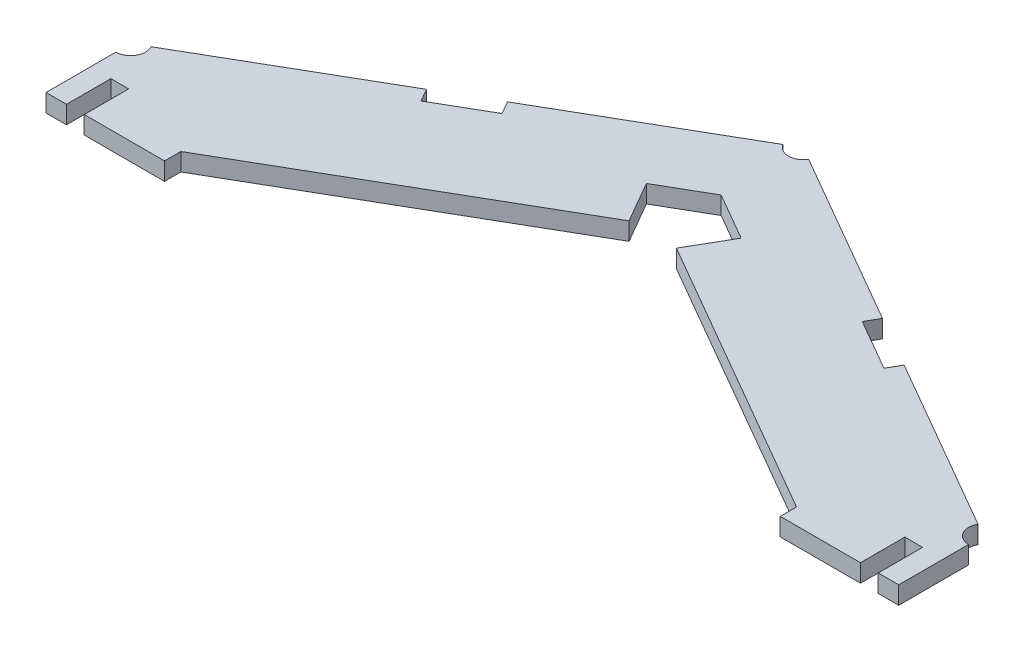
ISO-10303-21;
HEADER;
FILE_DESCRIPTION(('STEP AP214'),'2;1');
FILE_NAME('part.step','',(''),(''),'','','');
FILE_SCHEMA(('AUTOMOTIVE_DESIGN { 1 0 10303 214 1 1 1 1 }'));
ENDSEC;
DATA;
#1=APPLICATION_CONTEXT('core data for automotive mechanical design processes');
#2=APPLICATION_PROTOCOL_DEFINITION('international standard','automotive_design',2000,#1);
#3=PRODUCT_CONTEXT('',#1,'mechanical');
#4=PRODUCT('Part','Part','',(#3));
#5=PRODUCT_RELATED_PRODUCT_CATEGORY('part','',(#4));
#6=PRODUCT_DEFINITION_FORMATION('','',#4);
#7=PRODUCT_DEFINITION_CONTEXT('part definition',#1,'design');
#8=PRODUCT_DEFINITION('design','',#6,#7);
#9=PRODUCT_DEFINITION_SHAPE('','',#8);
#10=(LENGTH_UNIT() NAMED_UNIT(*) SI_UNIT(.MILLI.,.METRE.));
#11=(NAMED_UNIT(*) PLANE_ANGLE_UNIT() SI_UNIT($,.RADIAN.));
#12=(NAMED_UNIT(*) SI_UNIT($,.STERADIAN.) SOLID_ANGLE_UNIT());
#13=UNCERTAINTY_MEASURE_WITH_UNIT(LENGTH_MEASURE(1.E-05),#10,'distance_accuracy_value','');
#14=(GEOMETRIC_REPRESENTATION_CONTEXT(3) GLOBAL_UNCERTAINTY_ASSIGNED_CONTEXT((#13)) GLOBAL_UNIT_ASSIGNED_CONTEXT((#10,
#11,#12)) REPRESENTATION_CONTEXT('',''));
#15=CARTESIAN_POINT('',(0.,0.,0.));
#16=DIRECTION('',(0.,0.,1.));
#17=DIRECTION('',(1.,0.,0.));
#18=AXIS2_PLACEMENT_3D('',#15,#16,#17);
#19=CARTESIAN_POINT('',(-71.9715242270662,-30.,-27.25));
#20=DIRECTION('',(0.,-1.,0.));
#21=DIRECTION('',(0.,0.,-1.));
#22=AXIS2_PLACEMENT_3D('',#19,#20,#21);
#23=PLANE('',#22);
#24=DIRECTION('',(0.866025403784439,0.,0.5));
#25=VECTOR('',#24,1.);
#26=CARTESIAN_POINT('',(71.9615242270662,-30.,-41.5470053837925));
#27=LINE('',#26,#25);
#28=CARTESIAN_POINT('',(40.3108891324556,-30.,-59.8205080756885));
#29=VERTEX_POINT('',#28);
#30=CARTESIAN_POINT('',(69.7964607176053,-30.,-42.7970053837924));
#31=VERTEX_POINT('',#30);
#32=EDGE_CURVE('E656',#29,#31,#27,.T.);
#33=ORIENTED_EDGE('',*,*,#32,.F.);
#34=DIRECTION('',(0.500000000000006,0.,-0.866025403784435));
#35=VECTOR('',#34,1.);
#36=CARTESIAN_POINT('',(39.0608891324556,-30.,-57.6554445662274));
#37=LINE('',#36,#35);
#38=CARTESIAN_POINT('',(39.0608891324556,-30.,-57.6554445662274));
#39=VERTEX_POINT('',#38);
#40=EDGE_CURVE('E598',#39,#29,#37,.T.);
#41=ORIENTED_EDGE('',*,*,#40,.F.);
#42=DIRECTION('',(0.866025403784436,0.,0.500000000000005));
#43=VECTOR('',#42,1.);
#44=CARTESIAN_POINT('',(39.0608891324556,-30.,-57.6554445662274));
#45=LINE('',#44,#43);
#46=CARTESIAN_POINT('',(30.4006350946112,-30.,-62.6554445662274));
#47=VERTEX_POINT('',#46);
#48=EDGE_CURVE('E593',#47,#39,#45,.T.);
#49=ORIENTED_EDGE('',*,*,#48,.F.);
#50=DIRECTION('',(-0.500000000000005,0.,0.866025403784436));
#51=VECTOR('',#50,1.);
#52=CARTESIAN_POINT('',(30.4006350946112,-30.,-62.6554445662274));
#53=LINE('',#52,#51);
#54=CARTESIAN_POINT('',(31.6506350946112,-30.,-64.8205080756885));
#55=VERTEX_POINT('',#54);
#56=EDGE_CURVE('E662',#55,#47,#53,.T.);
#57=ORIENTED_EDGE('',*,*,#56,.F.);
#58=DIRECTION('',(0.866025403784439,0.,0.5));
#59=VECTOR('',#58,1.);
#60=CARTESIAN_POINT('',(71.9615242270662,-30.,-41.5470053837925));
#61=LINE('',#60,#59);
#62=CARTESIAN_POINT('',(2.1650635094611,-30.,-81.8440107675849));
#63=VERTEX_POINT('',#62);
#64=EDGE_CURVE('E584',#63,#55,#61,.T.);
#65=ORIENTED_EDGE('',*,*,#64,.F.);
#66=CARTESIAN_POINT('',(0.,-30.,-83.0940107675849));
#67=DIRECTION('',(0.,-1.,0.));
#68=DIRECTION('',(0.,0.,-1.));
#69=AXIS2_PLACEMENT_3D('',#66,#67,#68);
#70=CIRCLE('',#69,2.5);
#71=CARTESIAN_POINT('',(-2.16506350946109,-30.,-81.8440107675849));
#72=VERTEX_POINT('',#71);
#73=EDGE_CURVE('E578',#72,#63,#70,.F.);
#74=ORIENTED_EDGE('',*,*,#73,.F.);
#75=DIRECTION('',(0.866025403784439,0.,-0.5));
#76=VECTOR('',#75,1.);
#77=CARTESIAN_POINT('',(0.,-30.,-83.0940107675849));
#78=LINE('',#77,#76);
#79=CARTESIAN_POINT('',(-31.6506350946108,-30.,-64.8205080756888));
#80=VERTEX_POINT('',#79);
#81=EDGE_CURVE('E666',#80,#72,#78,.T.);
#82=ORIENTED_EDGE('',*,*,#81,.F.);
#83=DIRECTION('',(-0.499999999999999,0.,-0.866025403784439));
#84=VECTOR('',#83,1.);
#85=CARTESIAN_POINT('',(-30.4006350946108,-30.,-62.6554445662276));
#86=LINE('',#85,#84);
#87=CARTESIAN_POINT('',(-30.4006350946108,-30.,-62.6554445662276));
#88=VERTEX_POINT('',#87);
#89=EDGE_CURVE('E568',#88,#80,#86,.T.);
#90=ORIENTED_EDGE('',*,*,#89,.F.);
#91=DIRECTION('',(0.86602540378444,0.,-0.499999999999998));
#92=VECTOR('',#91,1.);
#93=CARTESIAN_POINT('',(-30.4006350946108,-30.,-62.6554445662276));
#94=LINE('',#93,#92);
#95=CARTESIAN_POINT('',(-39.0608891324552,-30.,-57.6554445662277));
#96=VERTEX_POINT('',#95);
#97=EDGE_CURVE('E563',#96,#88,#94,.T.);
#98=ORIENTED_EDGE('',*,*,#97,.F.);
#99=DIRECTION('',(0.499999999999999,0.,0.866025403784439));
#100=VECTOR('',#99,1.);
#101=CARTESIAN_POINT('',(-39.0608891324552,-30.,-57.6554445662277));
#102=LINE('',#101,#100);
#103=CARTESIAN_POINT('',(-40.3108891324552,-30.,-59.8205080756888));
#104=VERTEX_POINT('',#103);
#105=EDGE_CURVE('E670',#104,#96,#102,.T.);
#106=ORIENTED_EDGE('',*,*,#105,.F.);
#107=DIRECTION('',(0.866025403784439,0.,-0.5));
#108=VECTOR('',#107,1.);
#109=CARTESIAN_POINT('',(0.,-30.,-83.0940107675849));
#110=LINE('',#109,#108);
#111=CARTESIAN_POINT('',(-69.7964607176044,-30.,-42.7970053837929));
#112=VERTEX_POINT('',#111);
#113=EDGE_CURVE('E554',#112,#104,#110,.T.);
#114=ORIENTED_EDGE('',*,*,#113,.F.);
#115=CARTESIAN_POINT('',(-71.9615242270657,-30.,-41.5470053837933));
#116=DIRECTION('',(0.,-1.,0.));
#117=DIRECTION('',(0.,0.,-1.));
#118=AXIS2_PLACEMENT_3D('',#115,#116,#117);
#119=CIRCLE('',#118,2.5);
#120=CARTESIAN_POINT('',(-71.9615242270662,-30.,-39.0470053837933));
#121=VERTEX_POINT('',#120);
#122=EDGE_CURVE('E548',#121,#112,#119,.F.);
#123=ORIENTED_EDGE('',*,*,#122,.F.);
#124=DIRECTION('',(0.,0.,-1.));
#125=VECTOR('',#124,1.);
#126=CARTESIAN_POINT('',(-71.9615242270662,-30.,-41.5470053837925));
#127=LINE('',#126,#125);
#128=CARTESIAN_POINT('',(-71.9615242270662,-30.,-27.25));
#129=VERTEX_POINT('',#128);
#130=EDGE_CURVE('E363',#129,#121,#127,.T.);
#131=ORIENTED_EDGE('',*,*,#130,.F.);
#132=DIRECTION('',(1.,0.,0.));
#133=VECTOR('',#132,1.);
#134=CARTESIAN_POINT('',(-113.272742430532,-30.,-27.25));
#135=LINE('',#134,#133);
#136=CARTESIAN_POINT('',(-68.5064315060166,-30.,-27.25));
#137=VERTEX_POINT('',#136);
#138=EDGE_CURVE('E453',#129,#137,#135,.T.);
#139=ORIENTED_EDGE('',*,*,#138,.T.);
#140=DIRECTION('',(0.,0.,1.));
#141=VECTOR('',#140,1.);
#142=CARTESIAN_POINT('',(-68.5064315060166,-30.,-34.75));
#143=LINE('',#142,#141);
#144=CARTESIAN_POINT('',(-68.5064315060166,-30.,-34.75));
#145=VERTEX_POINT('',#144);
#146=EDGE_CURVE('E494',#145,#137,#143,.T.);
#147=ORIENTED_EDGE('',*,*,#146,.F.);
#148=DIRECTION('',(-1.,0.,0.));
#149=VECTOR('',#148,1.);
#150=CARTESIAN_POINT('',(-68.5064315060166,-30.,-34.75));
#151=LINE('',#150,#149);
#152=CARTESIAN_POINT('',(-65.5064315060166,-30.,-34.75));
#153=VERTEX_POINT('',#152);
#154=EDGE_CURVE('E497',#153,#145,#151,.T.);
#155=ORIENTED_EDGE('',*,*,#154,.F.);
#156=DIRECTION('',(0.,0.,-1.));
#157=VECTOR('',#156,1.);
#158=CARTESIAN_POINT('',(-65.5064315060166,-30.,-34.75));
#159=LINE('',#158,#157);
#160=CARTESIAN_POINT('',(-65.5064315060166,-30.,-27.25));
#161=VERTEX_POINT('',#160);
#162=EDGE_CURVE('E450',#161,#153,#159,.T.);
#163=ORIENTED_EDGE('',*,*,#162,.F.);
#164=DIRECTION('',(1.,0.,0.));
#165=VECTOR('',#164,1.);
#166=CARTESIAN_POINT('',(-113.272742430532,-30.,-27.25));
#167=LINE('',#166,#165);
#168=CARTESIAN_POINT('',(-51.9615242270664,-30.,-27.25));
#169=VERTEX_POINT('',#168);
#170=EDGE_CURVE('E266',#161,#169,#167,.T.);
#171=ORIENTED_EDGE('',*,*,#170,.T.);
#172=DIRECTION('',(0.,0.,-1.));
#173=VECTOR('',#172,1.);
#174=CARTESIAN_POINT('',(-51.9615242270663,-30.,29.9999999999999));
#175=LINE('',#174,#173);
#176=CARTESIAN_POINT('',(-51.9615242270664,-30.,-29.9999999999999));
#177=VERTEX_POINT('',#176);
#178=EDGE_CURVE('E312',#169,#177,#175,.T.);
#179=ORIENTED_EDGE('',*,*,#178,.T.);
#180=DIRECTION('',(0.866025403784439,0.,-0.499999999999999));
#181=VECTOR('',#180,1.);
#182=CARTESIAN_POINT('',(-51.9615242270664,-30.,-29.9999999999999));
#183=LINE('',#182,#181);
#184=CARTESIAN_POINT('',(-3.99519052838323,-30.,-57.693375672974));
#185=VERTEX_POINT('',#184);
#186=EDGE_CURVE('E473',#177,#185,#183,.T.);
#187=ORIENTED_EDGE('',*,*,#186,.T.);
#188=DIRECTION('',(-0.5,0.,-0.866025403784439));
#189=VECTOR('',#188,1.);
#190=CARTESIAN_POINT('',(-6.49519052838328,-30.,-62.0235026918963));
#191=LINE('',#190,#189);
#192=CARTESIAN_POINT('',(-7.99519052838324,-30.,-64.6215789032495));
#193=VERTEX_POINT('',#192);
#194=EDGE_CURVE('E351',#185,#193,#191,.T.);
#195=ORIENTED_EDGE('',*,*,#194,.T.);
#196=DIRECTION('',(0.866025403784439,0.,-0.5));
#197=VECTOR('',#196,1.);
#198=CARTESIAN_POINT('',(-59.9615242270663,-30.,-34.6188021535169));
#199=LINE('',#198,#197);
#200=CARTESIAN_POINT('',(0.,-30.,-69.2376043070339));
#201=VERTEX_POINT('',#200);
#202=EDGE_CURVE('E466',#193,#201,#199,.T.);
#203=ORIENTED_EDGE('',*,*,#202,.T.);
#204=DIRECTION('',(0.866025403784439,0.,0.5));
#205=VECTOR('',#204,1.);
#206=CARTESIAN_POINT('',(0.,-30.,-69.2376043070339));
#207=LINE('',#206,#205);
#208=CARTESIAN_POINT('',(7.99519052838324,-30.,-64.6215789032495));
#209=VERTEX_POINT('',#208);
#210=EDGE_CURVE('E463',#201,#209,#207,.T.);
#211=ORIENTED_EDGE('',*,*,#210,.T.);
#212=DIRECTION('',(-0.500000000000001,0.,0.866025403784438));
#213=VECTOR('',#212,1.);
#214=CARTESIAN_POINT('',(7.99519052838324,-30.,-64.6215789032495));
#215=LINE('',#214,#213);
#216=CARTESIAN_POINT('',(3.99519052838321,-30.,-57.6933756729741));
#217=VERTEX_POINT('',#216);
#218=EDGE_CURVE('E460',#209,#217,#215,.T.);
#219=ORIENTED_EDGE('',*,*,#218,.T.);
#220=DIRECTION('',(0.866025403784438,0.,0.500000000000001));
#221=VECTOR('',#220,1.);
#222=CARTESIAN_POINT('',(0.,-30.,-59.9999999999999));
#223=LINE('',#222,#221);
#224=CARTESIAN_POINT('',(51.9615242270662,-30.,-29.9999999999998));
#225=VERTEX_POINT('',#224);
#226=EDGE_CURVE('E475',#217,#225,#223,.T.);
#227=ORIENTED_EDGE('',*,*,#226,.T.);
#228=DIRECTION('',(0.,0.,1.));
#229=VECTOR('',#228,1.);
#230=CARTESIAN_POINT('',(51.9615242270662,-30.,-29.9999999999998));
#231=LINE('',#230,#229);
#232=CARTESIAN_POINT('',(51.9615242270662,-30.,-27.25));
#233=VERTEX_POINT('',#232);
#234=EDGE_CURVE('E47',#225,#233,#231,.T.);
#235=ORIENTED_EDGE('',*,*,#234,.T.);
#236=DIRECTION('',(1.,0.,0.));
#237=VECTOR('',#236,1.);
#238=CARTESIAN_POINT('',(-113.272742430532,-30.,-27.25));
#239=LINE('',#238,#237);
#240=CARTESIAN_POINT('',(65.5064315060166,-30.,-27.25));
#241=VERTEX_POINT('',#240);
#242=EDGE_CURVE('E456',#233,#241,#239,.T.);
#243=ORIENTED_EDGE('',*,*,#242,.T.);
#244=DIRECTION('',(0.,0.,1.));
#245=VECTOR('',#244,1.);
#246=CARTESIAN_POINT('',(65.5064315060166,-30.,-34.75));
#247=LINE('',#246,#245);
#248=CARTESIAN_POINT('',(65.5064315060166,-30.,-34.75));
#249=VERTEX_POINT('',#248);
#250=EDGE_CURVE('E492',#249,#241,#247,.T.);
#251=ORIENTED_EDGE('',*,*,#250,.F.);
#252=DIRECTION('',(-1.,0.,0.));
#253=VECTOR('',#252,1.);
#254=CARTESIAN_POINT('',(68.5064315060166,-30.,-34.75));
#255=LINE('',#254,#253);
#256=CARTESIAN_POINT('',(68.5064315060166,-30.,-34.75));
#257=VERTEX_POINT('',#256);
#258=EDGE_CURVE('E499',#257,#249,#255,.T.);
#259=ORIENTED_EDGE('',*,*,#258,.F.);
#260=DIRECTION('',(0.,0.,-1.));
#261=VECTOR('',#260,1.);
#262=CARTESIAN_POINT('',(68.5064315060166,-30.,-34.75));
#263=LINE('',#262,#261);
#264=CARTESIAN_POINT('',(68.5064315060166,-30.,-27.25));
#265=VERTEX_POINT('',#264);
#266=EDGE_CURVE('E495',#265,#257,#263,.T.);
#267=ORIENTED_EDGE('',*,*,#266,.F.);
#268=DIRECTION('',(1.,0.,0.));
#269=VECTOR('',#268,1.);
#270=CARTESIAN_POINT('',(-113.272742430532,-30.,-27.25));
#271=LINE('',#270,#269);
#272=CARTESIAN_POINT('',(71.9615242270662,-30.,-27.25));
#273=VERTEX_POINT('',#272);
#274=EDGE_CURVE('E356',#265,#273,#271,.T.);
#275=ORIENTED_EDGE('',*,*,#274,.T.);
#276=DIRECTION('',(0.,0.,1.));
#277=VECTOR('',#276,1.);
#278=CARTESIAN_POINT('',(71.9615242270662,-30.,41.5470053837925));
#279=LINE('',#278,#277);
#280=CARTESIAN_POINT('',(71.9615242270662,-30.,-39.0470053837923));
#281=VERTEX_POINT('',#280);
#282=EDGE_CURVE('E371',#281,#273,#279,.T.);
#283=ORIENTED_EDGE('',*,*,#282,.F.);
#284=CARTESIAN_POINT('',(71.9615242270663,-30.,-41.5470053837923));
#285=DIRECTION('',(0.,-1.,0.));
#286=DIRECTION('',(0.,0.,-1.));
#287=AXIS2_PLACEMENT_3D('',#284,#285,#286);
#288=CIRCLE('',#287,2.5);
#289=EDGE_CURVE('E279',#31,#281,#288,.F.);
#290=ORIENTED_EDGE('',*,*,#289,.F.);
#291=EDGE_LOOP('',(#33,#41,#49,#57,#65,#74,#82,#90,#98,#106,#114,#123,#131,#139,#147,#155,#163,
#171,#179,#187,#195,#203,#211,#219,#227,#235,#243,#251,#259,#267,#275,#283,#290));
#292=FACE_BOUND('',#291,.T.);
#293=ADVANCED_FACE('F43',(#292),#23,.F.);
#294=CARTESIAN_POINT('',(-71.9715242270662,-33.,-27.25));
#295=DIRECTION('',(0.,-1.,0.));
#296=DIRECTION('',(0.,0.,-1.));
#297=AXIS2_PLACEMENT_3D('',#294,#295,#296);
#298=PLANE('',#297);
#299=DIRECTION('',(-0.500000000000001,0.,0.866025403784438));
#300=VECTOR('',#299,1.);
#301=CARTESIAN_POINT('',(7.99519052838324,-33.,-64.6215789032495));
#302=LINE('',#301,#300);
#303=CARTESIAN_POINT('',(7.99519052838323,-33.,-64.6215789032495));
#304=VERTEX_POINT('',#303);
#305=CARTESIAN_POINT('',(3.99519052838321,-33.,-57.693375672974));
#306=VERTEX_POINT('',#305);
#307=EDGE_CURVE('E66',#304,#306,#302,.T.);
#308=ORIENTED_EDGE('',*,*,#307,.F.);
#309=DIRECTION('',(0.866025403784441,0.,0.499999999999997));
#310=VECTOR('',#309,1.);
#311=CARTESIAN_POINT('',(0.,-33.,-69.2376043070339));
#312=LINE('',#311,#310);
#313=CARTESIAN_POINT('',(0.,-33.,-69.2376043070339));
#314=VERTEX_POINT('',#313);
#315=EDGE_CURVE('E372',#314,#304,#312,.T.);
#316=ORIENTED_EDGE('',*,*,#315,.F.);
#317=DIRECTION('',(0.866025403784438,0.,-0.5));
#318=VECTOR('',#317,1.);
#319=CARTESIAN_POINT('',(-7.99519052838324,-33.,-64.6215789032495));
#320=LINE('',#319,#318);
#321=CARTESIAN_POINT('',(-7.99519052838324,-33.,-64.6215789032495));
#322=VERTEX_POINT('',#321);
#323=EDGE_CURVE('E60',#322,#314,#320,.T.);
#324=ORIENTED_EDGE('',*,*,#323,.F.);
#325=DIRECTION('',(-0.5,0.,-0.866025403784439));
#326=VECTOR('',#325,1.);
#327=CARTESIAN_POINT('',(-6.49519052838328,-33.,-62.0235026918963));
#328=LINE('',#327,#326);
#329=CARTESIAN_POINT('',(-3.99519052838323,-33.,-57.693375672974));
#330=VERTEX_POINT('',#329);
#331=EDGE_CURVE('E376',#330,#322,#328,.T.);
#332=ORIENTED_EDGE('',*,*,#331,.F.);
#333=DIRECTION('',(0.866025403784439,0.,-0.499999999999999));
#334=VECTOR('',#333,1.);
#335=CARTESIAN_POINT('',(-51.9615242270664,-33.,-29.9999999999999));
#336=LINE('',#335,#334);
#337=CARTESIAN_POINT('',(-51.9615242270664,-33.,-29.9999999999999));
#338=VERTEX_POINT('',#337);
#339=EDGE_CURVE('E362',#338,#330,#336,.T.);
#340=ORIENTED_EDGE('',*,*,#339,.F.);
#341=DIRECTION('',(0.,0.,-1.));
#342=VECTOR('',#341,1.);
#343=CARTESIAN_POINT('',(-51.9615242270663,-33.,29.9999999999999));
#344=LINE('',#343,#342);
#345=CARTESIAN_POINT('',(-51.9615242270664,-33.,-27.25));
#346=VERTEX_POINT('',#345);
#347=EDGE_CURVE('E278',#346,#338,#344,.T.);
#348=ORIENTED_EDGE('',*,*,#347,.F.);
#349=DIRECTION('',(1.,0.,0.));
#350=VECTOR('',#349,1.);
#351=CARTESIAN_POINT('',(-113.272742430532,-33.,-27.25));
#352=LINE('',#351,#350);
#353=CARTESIAN_POINT('',(-65.5064315060166,-33.,-27.25));
#354=VERTEX_POINT('',#353);
#355=EDGE_CURVE('E263',#354,#346,#352,.T.);
#356=ORIENTED_EDGE('',*,*,#355,.F.);
#357=DIRECTION('',(0.,0.,-1.));
#358=VECTOR('',#357,1.);
#359=CARTESIAN_POINT('',(-65.5064315060166,-33.,-34.75));
#360=LINE('',#359,#358);
#361=CARTESIAN_POINT('',(-65.5064315060166,-33.,-34.75));
#362=VERTEX_POINT('',#361);
#363=EDGE_CURVE('E276',#354,#362,#360,.T.);
#364=ORIENTED_EDGE('',*,*,#363,.T.);
#365=DIRECTION('',(-1.,0.,0.));
#366=VECTOR('',#365,1.);
#367=CARTESIAN_POINT('',(-68.5064315060166,-33.,-34.75));
#368=LINE('',#367,#366);
#369=CARTESIAN_POINT('',(-68.5064315060166,-33.,-34.75));
#370=VERTEX_POINT('',#369);
#371=EDGE_CURVE('E286',#362,#370,#368,.T.);
#372=ORIENTED_EDGE('',*,*,#371,.T.);
#373=DIRECTION('',(0.,0.,1.));
#374=VECTOR('',#373,1.);
#375=CARTESIAN_POINT('',(-68.5064315060166,-33.,-34.75));
#376=LINE('',#375,#374);
#377=CARTESIAN_POINT('',(-68.5064315060166,-33.,-27.25));
#378=VERTEX_POINT('',#377);
#379=EDGE_CURVE('E288',#370,#378,#376,.T.);
#380=ORIENTED_EDGE('',*,*,#379,.T.);
#381=DIRECTION('',(1.,0.,0.));
#382=VECTOR('',#381,1.);
#383=CARTESIAN_POINT('',(-113.272742430532,-33.,-27.25));
#384=LINE('',#383,#382);
#385=CARTESIAN_POINT('',(-71.9615242270662,-33.,-27.25));
#386=VERTEX_POINT('',#385);
#387=EDGE_CURVE('E355',#386,#378,#384,.T.);
#388=ORIENTED_EDGE('',*,*,#387,.F.);
#389=DIRECTION('',(0.,0.,-1.));
#390=VECTOR('',#389,1.);
#391=CARTESIAN_POINT('',(-71.9615242270662,-33.,-41.5470053837925));
#392=LINE('',#391,#390);
#393=CARTESIAN_POINT('',(-71.9615242270662,-33.,-39.0470053837933));
#394=VERTEX_POINT('',#393);
#395=EDGE_CURVE('E308',#386,#394,#392,.T.);
#396=ORIENTED_EDGE('',*,*,#395,.T.);
#397=CARTESIAN_POINT('',(-71.9615242270657,-33.,-41.5470053837933));
#398=DIRECTION('',(0.,-1.,0.));
#399=DIRECTION('',(0.,0.,-1.));
#400=AXIS2_PLACEMENT_3D('',#397,#398,#399);
#401=CIRCLE('',#400,2.5);
#402=CARTESIAN_POINT('',(-69.7964607176044,-33.,-42.7970053837929));
#403=VERTEX_POINT('',#402);
#404=EDGE_CURVE('E311',#394,#403,#401,.F.);
#405=ORIENTED_EDGE('',*,*,#404,.T.);
#406=DIRECTION('',(0.866025403784439,0.,-0.5));
#407=VECTOR('',#406,1.);
#408=CARTESIAN_POINT('',(0.,-33.,-83.0940107675849));
#409=LINE('',#408,#407);
#410=CARTESIAN_POINT('',(-40.3108891324552,-33.,-59.8205080756888));
#411=VERTEX_POINT('',#410);
#412=EDGE_CURVE('E315',#403,#411,#409,.T.);
#413=ORIENTED_EDGE('',*,*,#412,.T.);
#414=DIRECTION('',(0.499999999999999,0.,0.866025403784439));
#415=VECTOR('',#414,1.);
#416=CARTESIAN_POINT('',(-39.0608891324552,-33.,-57.6554445662277));
#417=LINE('',#416,#415);
#418=CARTESIAN_POINT('',(-39.0608891324552,-33.,-57.6554445662277));
#419=VERTEX_POINT('',#418);
#420=EDGE_CURVE('E318',#411,#419,#417,.T.);
#421=ORIENTED_EDGE('',*,*,#420,.T.);
#422=DIRECTION('',(0.86602540378444,0.,-0.499999999999998));
#423=VECTOR('',#422,1.);
#424=CARTESIAN_POINT('',(-30.4006350946108,-33.,-62.6554445662276));
#425=LINE('',#424,#423);
#426=CARTESIAN_POINT('',(-30.4006350946108,-33.,-62.6554445662276));
#427=VERTEX_POINT('',#426);
#428=EDGE_CURVE('E321',#419,#427,#425,.T.);
#429=ORIENTED_EDGE('',*,*,#428,.T.);
#430=DIRECTION('',(-0.499999999999999,0.,-0.866025403784439));
#431=VECTOR('',#430,1.);
#432=CARTESIAN_POINT('',(-30.4006350946108,-33.,-62.6554445662276));
#433=LINE('',#432,#431);
#434=CARTESIAN_POINT('',(-31.6506350946108,-33.,-64.8205080756888));
#435=VERTEX_POINT('',#434);
#436=EDGE_CURVE('E324',#427,#435,#433,.T.);
#437=ORIENTED_EDGE('',*,*,#436,.T.);
#438=DIRECTION('',(0.866025403784439,0.,-0.5));
#439=VECTOR('',#438,1.);
#440=CARTESIAN_POINT('',(0.,-33.,-83.0940107675849));
#441=LINE('',#440,#439);
#442=CARTESIAN_POINT('',(-2.16506350946109,-33.,-81.8440107675849));
#443=VERTEX_POINT('',#442);
#444=EDGE_CURVE('E327',#435,#443,#441,.T.);
#445=ORIENTED_EDGE('',*,*,#444,.T.);
#446=CARTESIAN_POINT('',(0.,-33.,-83.0940107675849));
#447=DIRECTION('',(0.,-1.,0.));
#448=DIRECTION('',(0.,0.,-1.));
#449=AXIS2_PLACEMENT_3D('',#446,#447,#448);
#450=CIRCLE('',#449,2.5);
#451=CARTESIAN_POINT('',(2.1650635094611,-33.,-81.8440107675849));
#452=VERTEX_POINT('',#451);
#453=EDGE_CURVE('E330',#443,#452,#450,.F.);
#454=ORIENTED_EDGE('',*,*,#453,.T.);
#455=DIRECTION('',(0.866025403784439,0.,0.5));
#456=VECTOR('',#455,1.);
#457=CARTESIAN_POINT('',(71.9615242270662,-33.,-41.5470053837925));
#458=LINE('',#457,#456);
#459=CARTESIAN_POINT('',(31.6506350946112,-33.,-64.8205080756885));
#460=VERTEX_POINT('',#459);
#461=EDGE_CURVE('E333',#452,#460,#458,.T.);
#462=ORIENTED_EDGE('',*,*,#461,.T.);
#463=DIRECTION('',(-0.500000000000005,0.,0.866025403784436));
#464=VECTOR('',#463,1.);
#465=CARTESIAN_POINT('',(30.4006350946112,-33.,-62.6554445662274));
#466=LINE('',#465,#464);
#467=CARTESIAN_POINT('',(30.4006350946112,-33.,-62.6554445662274));
#468=VERTEX_POINT('',#467);
#469=EDGE_CURVE('E336',#460,#468,#466,.T.);
#470=ORIENTED_EDGE('',*,*,#469,.T.);
#471=DIRECTION('',(0.866025403784436,0.,0.500000000000005));
#472=VECTOR('',#471,1.);
#473=CARTESIAN_POINT('',(39.0608891324556,-33.,-57.6554445662274));
#474=LINE('',#473,#472);
#475=CARTESIAN_POINT('',(39.0608891324556,-33.,-57.6554445662274));
#476=VERTEX_POINT('',#475);
#477=EDGE_CURVE('E339',#468,#476,#474,.T.);
#478=ORIENTED_EDGE('',*,*,#477,.T.);
#479=DIRECTION('',(0.500000000000006,0.,-0.866025403784435));
#480=VECTOR('',#479,1.);
#481=CARTESIAN_POINT('',(39.0608891324556,-33.,-57.6554445662274));
#482=LINE('',#481,#480);
#483=CARTESIAN_POINT('',(40.3108891324556,-33.,-59.8205080756885));
#484=VERTEX_POINT('',#483);
#485=EDGE_CURVE('E342',#476,#484,#482,.T.);
#486=ORIENTED_EDGE('',*,*,#485,.T.);
#487=DIRECTION('',(0.866025403784439,0.,0.5));
#488=VECTOR('',#487,1.);
#489=CARTESIAN_POINT('',(71.9615242270662,-33.,-41.5470053837925));
#490=LINE('',#489,#488);
#491=CARTESIAN_POINT('',(69.7964607176053,-33.,-42.7970053837924));
#492=VERTEX_POINT('',#491);
#493=EDGE_CURVE('E345',#484,#492,#490,.T.);
#494=ORIENTED_EDGE('',*,*,#493,.T.);
#495=CARTESIAN_POINT('',(71.9615242270663,-33.,-41.5470053837923));
#496=DIRECTION('',(0.,-1.,0.));
#497=DIRECTION('',(0.,0.,-1.));
#498=AXIS2_PLACEMENT_3D('',#495,#496,#497);
#499=CIRCLE('',#498,2.5);
#500=CARTESIAN_POINT('',(71.9615242270662,-33.,-39.0470053837923));
#501=VERTEX_POINT('',#500);
#502=EDGE_CURVE('E348',#492,#501,#499,.F.);
#503=ORIENTED_EDGE('',*,*,#502,.T.);
#504=DIRECTION('',(0.,0.,1.));
#505=VECTOR('',#504,1.);
#506=CARTESIAN_POINT('',(71.9615242270662,-33.,41.5470053837925));
#507=LINE('',#506,#505);
#508=CARTESIAN_POINT('',(71.9615242270662,-33.,-27.25));
#509=VERTEX_POINT('',#508);
#510=EDGE_CURVE('E305',#501,#509,#507,.T.);
#511=ORIENTED_EDGE('',*,*,#510,.T.);
#512=DIRECTION('',(1.,0.,0.));
#513=VECTOR('',#512,1.);
#514=CARTESIAN_POINT('',(-113.272742430532,-33.,-27.25));
#515=LINE('',#514,#513);
#516=CARTESIAN_POINT('',(68.5064315060166,-33.,-27.25));
#517=VERTEX_POINT('',#516);
#518=EDGE_CURVE('E352',#517,#509,#515,.T.);
#519=ORIENTED_EDGE('',*,*,#518,.F.);
#520=DIRECTION('',(0.,0.,-1.));
#521=VECTOR('',#520,1.);
#522=CARTESIAN_POINT('',(68.5064315060166,-33.,-34.75));
#523=LINE('',#522,#521);
#524=CARTESIAN_POINT('',(68.5064315060166,-33.,-34.75));
#525=VERTEX_POINT('',#524);
#526=EDGE_CURVE('E299',#517,#525,#523,.T.);
#527=ORIENTED_EDGE('',*,*,#526,.T.);
#528=DIRECTION('',(-1.,0.,0.));
#529=VECTOR('',#528,1.);
#530=CARTESIAN_POINT('',(68.5064315060166,-33.,-34.75));
#531=LINE('',#530,#529);
#532=CARTESIAN_POINT('',(65.5064315060166,-33.,-34.75));
#533=VERTEX_POINT('',#532);
#534=EDGE_CURVE('E302',#525,#533,#531,.T.);
#535=ORIENTED_EDGE('',*,*,#534,.T.);
#536=DIRECTION('',(0.,0.,1.));
#537=VECTOR('',#536,1.);
#538=CARTESIAN_POINT('',(65.5064315060166,-33.,-34.75));
#539=LINE('',#538,#537);
#540=CARTESIAN_POINT('',(65.5064315060166,-33.,-27.25));
#541=VERTEX_POINT('',#540);
#542=EDGE_CURVE('E296',#533,#541,#539,.T.);
#543=ORIENTED_EDGE('',*,*,#542,.T.);
#544=DIRECTION('',(1.,0.,0.));
#545=VECTOR('',#544,1.);
#546=CARTESIAN_POINT('',(-113.272742430532,-33.,-27.25));
#547=LINE('',#546,#545);
#548=CARTESIAN_POINT('',(51.9615242270662,-33.,-27.25));
#549=VERTEX_POINT('',#548);
#550=EDGE_CURVE('E280',#549,#541,#547,.T.);
#551=ORIENTED_EDGE('',*,*,#550,.F.);
#552=DIRECTION('',(0.,0.,1.));
#553=VECTOR('',#552,1.);
#554=CARTESIAN_POINT('',(51.9615242270662,-33.,-29.9999999999998));
#555=LINE('',#554,#553);
#556=CARTESIAN_POINT('',(51.9615242270662,-33.,-29.9999999999998));
#557=VERTEX_POINT('',#556);
#558=EDGE_CURVE('E369',#557,#549,#555,.T.);
#559=ORIENTED_EDGE('',*,*,#558,.F.);
#560=DIRECTION('',(0.866025403784438,0.,0.500000000000001));
#561=VECTOR('',#560,1.);
#562=CARTESIAN_POINT('',(0.,-33.,-59.9999999999999));
#563=LINE('',#562,#561);
#564=EDGE_CURVE('E366',#306,#557,#563,.T.);
#565=ORIENTED_EDGE('',*,*,#564,.F.);
#566=EDGE_LOOP('',(#308,#316,#324,#332,#340,#348,#356,#364,#372,#380,#388,#396,#405,#413,#421,
#429,#437,#445,#454,#462,#470,#478,#486,#494,#503,#511,#519,#527,#535,#543,#551,#559,#565));
#567=FACE_BOUND('',#566,.T.);
#568=ADVANCED_FACE('F274',(#567),#298,.T.);
#569=CARTESIAN_POINT('',(0.,-9.,-69.2376043070339));
#570=DIRECTION('',(-0.5,0.,0.866025403784439));
#571=DIRECTION('',(0.866025403784439,0.,0.5));
#572=AXIS2_PLACEMENT_3D('',#569,#570,#571);
#573=PLANE('',#572);
#574=ORIENTED_EDGE('',*,*,#210,.F.);
#575=DIRECTION('',(0.,1.,0.));
#576=VECTOR('',#575,1.);
#577=CARTESIAN_POINT('',(0.,-9.,-69.2376043070339));
#578=LINE('',#577,#576);
#579=EDGE_CURVE('E291',#314,#201,#578,.T.);
#580=ORIENTED_EDGE('',*,*,#579,.F.);
#581=ORIENTED_EDGE('',*,*,#315,.T.);
#582=DIRECTION('',(0.,1.,0.));
#583=VECTOR('',#582,1.);
#584=CARTESIAN_POINT('',(7.99519052838324,-33.,-64.6215789032495));
#585=LINE('',#584,#583);
#586=EDGE_CURVE('E444',#304,#209,#585,.T.);
#587=ORIENTED_EDGE('',*,*,#586,.T.);
#588=EDGE_LOOP('',(#574,#580,#581,#587));
#589=FACE_BOUND('',#588,.T.);
#590=ADVANCED_FACE('F510',(#589),#573,.T.);
#591=CARTESIAN_POINT('',(-59.9615242270663,-9.,-34.6188021535169));
#592=DIRECTION('',(0.5,0.,0.866025403784439));
#593=DIRECTION('',(0.866025403784439,0.,-0.5));
#594=AXIS2_PLACEMENT_3D('',#591,#592,#593);
#595=PLANE('',#594);
#596=ORIENTED_EDGE('',*,*,#202,.F.);
#597=DIRECTION('',(0.,1.,0.));
#598=VECTOR('',#597,1.);
#599=CARTESIAN_POINT('',(-7.99519052838324,-33.,-64.6215789032495));
#600=LINE('',#599,#598);
#601=EDGE_CURVE('E378',#322,#193,#600,.T.);
#602=ORIENTED_EDGE('',*,*,#601,.F.);
#603=ORIENTED_EDGE('',*,*,#323,.T.);
#604=ORIENTED_EDGE('',*,*,#579,.T.);
#605=EDGE_LOOP('',(#596,#602,#603,#604));
#606=FACE_BOUND('',#605,.T.);
#607=ADVANCED_FACE('F518',(#606),#595,.T.);
#608=CARTESIAN_POINT('',(7.99519052838324,-33.,-64.6215789032495));
#609=DIRECTION('',(-0.866025403784438,0.,-0.500000000000001));
#610=DIRECTION('',(-0.500000000000001,0.,0.866025403784438));
#611=AXIS2_PLACEMENT_3D('',#608,#609,#610);
#612=PLANE('',#611);
#613=ORIENTED_EDGE('',*,*,#218,.F.);
#614=ORIENTED_EDGE('',*,*,#586,.F.);
#615=ORIENTED_EDGE('',*,*,#307,.T.);
#616=DIRECTION('',(0.,-1.,0.));
#617=VECTOR('',#616,1.);
#618=CARTESIAN_POINT('',(3.99519052838321,-27.,-57.6933756729741));
#619=LINE('',#618,#617);
#620=EDGE_CURVE('E447',#217,#306,#619,.T.);
#621=ORIENTED_EDGE('',*,*,#620,.F.);
#622=EDGE_LOOP('',(#613,#614,#615,#621));
#623=FACE_BOUND('',#622,.T.);
#624=ADVANCED_FACE('F513',(#623),#612,.T.);
#625=CARTESIAN_POINT('',(-113.272742430532,-42.01,-27.25));
#626=DIRECTION('',(0.,0.,1.));
#627=DIRECTION('',(1.,0.,0.));
#628=AXIS2_PLACEMENT_3D('',#625,#626,#627);
#629=PLANE('',#628);
#630=ORIENTED_EDGE('',*,*,#242,.F.);
#631=DIRECTION('',(0.,1.,0.));
#632=VECTOR('',#631,1.);
#633=CARTESIAN_POINT('',(51.9615242270662,-33.,-27.25));
#634=LINE('',#633,#632);
#635=EDGE_CURVE('E396',#549,#233,#634,.T.);
#636=ORIENTED_EDGE('',*,*,#635,.F.);
#637=ORIENTED_EDGE('',*,*,#550,.T.);
#638=DIRECTION('',(0.,-1.,0.));
#639=VECTOR('',#638,1.);
#640=CARTESIAN_POINT('',(65.5064315060166,-42.01,-27.25));
#641=LINE('',#640,#639);
#642=EDGE_CURVE('E386',#241,#541,#641,.T.);
#643=ORIENTED_EDGE('',*,*,#642,.F.);
#644=EDGE_LOOP('',(#630,#636,#637,#643));
#645=FACE_BOUND('',#644,.T.);
#646=ADVANCED_FACE('F488',(#645),#629,.T.);
#647=CARTESIAN_POINT('',(68.5064315060166,-51.,-34.75));
#648=DIRECTION('',(0.,0.,-1.));
#649=DIRECTION('',(-1.,0.,0.));
#650=AXIS2_PLACEMENT_3D('',#647,#648,#649);
#651=PLANE('',#650);
#652=DIRECTION('',(0.,1.,0.));
#653=VECTOR('',#652,1.);
#654=CARTESIAN_POINT('',(68.5064315060166,-51.,-34.75));
#655=LINE('',#654,#653);
#656=EDGE_CURVE('E11',#525,#257,#655,.T.);
#657=ORIENTED_EDGE('',*,*,#656,.T.);
#658=ORIENTED_EDGE('',*,*,#258,.T.);
#659=DIRECTION('',(0.,1.,0.));
#660=VECTOR('',#659,1.);
#661=CARTESIAN_POINT('',(65.5064315060166,-51.,-34.75));
#662=LINE('',#661,#660);
#663=EDGE_CURVE('E52',#533,#249,#662,.T.);
#664=ORIENTED_EDGE('',*,*,#663,.F.);
#665=ORIENTED_EDGE('',*,*,#534,.F.);
#666=EDGE_LOOP('',(#657,#658,#664,#665));
#667=FACE_BOUND('',#666,.T.);
#668=ADVANCED_FACE('F618',(#667),#651,.F.);
#669=CARTESIAN_POINT('',(65.5064315060166,-51.,-34.75));
#670=DIRECTION('',(-1.,0.,0.));
#671=DIRECTION('',(0.,0.,1.));
#672=AXIS2_PLACEMENT_3D('',#669,#670,#671);
#673=PLANE('',#672);
#674=ORIENTED_EDGE('',*,*,#663,.T.);
#675=ORIENTED_EDGE('',*,*,#250,.T.);
#676=ORIENTED_EDGE('',*,*,#642,.T.);
#677=ORIENTED_EDGE('',*,*,#542,.F.);
#678=EDGE_LOOP('',(#674,#675,#676,#677));
#679=FACE_BOUND('',#678,.T.);
#680=ADVANCED_FACE('F491',(#679),#673,.F.);
#681=ORIENTED_EDGE('',*,*,#274,.F.);
#682=DIRECTION('',(0.,1.,0.));
#683=VECTOR('',#682,1.);
#684=CARTESIAN_POINT('',(68.5064315060166,-42.01,-27.25));
#685=LINE('',#684,#683);
#686=EDGE_CURVE('E270',#517,#265,#685,.T.);
#687=ORIENTED_EDGE('',*,*,#686,.F.);
#688=ORIENTED_EDGE('',*,*,#518,.T.);
#689=DIRECTION('',(0.,1.,0.));
#690=VECTOR('',#689,1.);
#691=CARTESIAN_POINT('',(71.9615242270662,9.,-27.25));
#692=LINE('',#691,#690);
#693=EDGE_CURVE('E391',#509,#273,#692,.T.);
#694=ORIENTED_EDGE('',*,*,#693,.T.);
#695=EDGE_LOOP('',(#681,#687,#688,#694));
#696=FACE_BOUND('',#695,.T.);
#697=ADVANCED_FACE('F611',(#696),#629,.T.);
#698=CARTESIAN_POINT('',(68.5064315060166,-51.,-34.75));
#699=DIRECTION('',(1.,0.,0.));
#700=DIRECTION('',(0.,0.,-1.));
#701=AXIS2_PLACEMENT_3D('',#698,#699,#700);
#702=PLANE('',#701);
#703=ORIENTED_EDGE('',*,*,#686,.T.);
#704=ORIENTED_EDGE('',*,*,#266,.T.);
#705=ORIENTED_EDGE('',*,*,#656,.F.);
#706=ORIENTED_EDGE('',*,*,#526,.F.);
#707=EDGE_LOOP('',(#703,#704,#705,#706));
#708=FACE_BOUND('',#707,.T.);
#709=ADVANCED_FACE('F614',(#708),#702,.F.);
#710=CARTESIAN_POINT('',(71.9615242270663,-41.,-41.5470053837923));
#711=DIRECTION('',(0.,1.,0.));
#712=DIRECTION('',(0.,0.,1.));
#713=AXIS2_PLACEMENT_3D('',#710,#711,#712);
#714=CYLINDRICAL_SURFACE('',#713,2.5);
#715=DIRECTION('',(0.,1.,0.));
#716=VECTOR('',#715,1.);
#717=CARTESIAN_POINT('',(69.7964607176053,-41.,-42.7970053837924));
#718=LINE('',#717,#716);
#719=EDGE_CURVE('E411',#31,#492,#718,.F.);
#720=ORIENTED_EDGE('',*,*,#719,.F.);
#721=ORIENTED_EDGE('',*,*,#289,.T.);
#722=DIRECTION('',(0.,1.,0.));
#723=VECTOR('',#722,1.);
#724=CARTESIAN_POINT('',(71.9615242270662,-41.,-39.0470053837923));
#725=LINE('',#724,#723);
#726=EDGE_CURVE('E413',#501,#281,#725,.T.);
#727=ORIENTED_EDGE('',*,*,#726,.F.);
#728=ORIENTED_EDGE('',*,*,#502,.F.);
#729=EDGE_LOOP('',(#720,#721,#727,#728));
#730=FACE_BOUND('',#729,.T.);
#731=ADVANCED_FACE('F628',(#730),#714,.F.);
#732=CARTESIAN_POINT('',(71.9615242270662,9.,41.5470053837925));
#733=DIRECTION('',(-1.,0.,0.));
#734=DIRECTION('',(0.,0.,1.));
#735=AXIS2_PLACEMENT_3D('',#732,#733,#734);
#736=PLANE('',#735);
#737=ORIENTED_EDGE('',*,*,#726,.T.);
#738=ORIENTED_EDGE('',*,*,#282,.T.);
#739=ORIENTED_EDGE('',*,*,#693,.F.);
#740=ORIENTED_EDGE('',*,*,#510,.F.);
#741=EDGE_LOOP('',(#737,#738,#739,#740));
#742=FACE_BOUND('',#741,.T.);
#743=ADVANCED_FACE('F608',(#742),#736,.F.);
#744=CARTESIAN_POINT('',(0.,-33.,-59.9999999999999));
#745=DIRECTION('',(-0.500000000000001,0.,0.866025403784438));
#746=DIRECTION('',(0.866025403784438,0.,0.500000000000001));
#747=AXIS2_PLACEMENT_3D('',#744,#745,#746);
#748=PLANE('',#747);
#749=ORIENTED_EDGE('',*,*,#226,.F.);
#750=ORIENTED_EDGE('',*,*,#620,.T.);
#751=ORIENTED_EDGE('',*,*,#564,.T.);
#752=DIRECTION('',(0.,1.,0.));
#753=VECTOR('',#752,1.);
#754=CARTESIAN_POINT('',(51.9615242270662,-33.,-29.9999999999998));
#755=LINE('',#754,#753);
#756=EDGE_CURVE('E438',#557,#225,#755,.T.);
#757=ORIENTED_EDGE('',*,*,#756,.T.);
#758=EDGE_LOOP('',(#749,#750,#751,#757));
#759=FACE_BOUND('',#758,.T.);
#760=ADVANCED_FACE('F620',(#759),#748,.T.);
#761=CARTESIAN_POINT('',(51.9615242270662,-33.,-29.9999999999998));
#762=DIRECTION('',(-1.,0.,0.));
#763=DIRECTION('',(0.,0.,1.));
#764=AXIS2_PLACEMENT_3D('',#761,#762,#763);
#765=PLANE('',#764);
#766=ORIENTED_EDGE('',*,*,#234,.F.);
#767=ORIENTED_EDGE('',*,*,#756,.F.);
#768=ORIENTED_EDGE('',*,*,#558,.T.);
#769=ORIENTED_EDGE('',*,*,#635,.T.);
#770=EDGE_LOOP('',(#766,#767,#768,#769));
#771=FACE_BOUND('',#770,.T.);
#772=ADVANCED_FACE('F485',(#771),#765,.T.);
#773=CARTESIAN_POINT('',(71.9615242270662,9.,-41.5470053837925));
#774=DIRECTION('',(-0.5,0.,0.866025403784439));
#775=DIRECTION('',(0.866025403784439,0.,0.5));
#776=AXIS2_PLACEMENT_3D('',#773,#774,#775);
#777=PLANE('',#776);
#778=DIRECTION('',(0.,1.,0.));
#779=VECTOR('',#778,1.);
#780=CARTESIAN_POINT('',(40.3108891324556,9.,-59.8205080756885));
#781=LINE('',#780,#779);
#782=EDGE_CURVE('E418',#484,#29,#781,.T.);
#783=ORIENTED_EDGE('',*,*,#782,.T.);
#784=ORIENTED_EDGE('',*,*,#32,.T.);
#785=ORIENTED_EDGE('',*,*,#719,.T.);
#786=ORIENTED_EDGE('',*,*,#493,.F.);
#787=EDGE_LOOP('',(#783,#784,#785,#786));
#788=FACE_BOUND('',#787,.T.);
#789=ADVANCED_FACE('F601',(#788),#777,.F.);
#790=CARTESIAN_POINT('',(39.0608891324556,-41.,-57.6554445662274));
#791=DIRECTION('',(0.866025403784435,0.,0.500000000000006));
#792=DIRECTION('',(0.500000000000006,0.,-0.866025403784435));
#793=AXIS2_PLACEMENT_3D('',#790,#791,#792);
#794=PLANE('',#793);
#795=DIRECTION('',(0.,1.,0.));
#796=VECTOR('',#795,1.);
#797=CARTESIAN_POINT('',(39.0608891324556,-41.,-57.6554445662274));
#798=LINE('',#797,#796);
#799=EDGE_CURVE('E432',#476,#39,#798,.T.);
#800=ORIENTED_EDGE('',*,*,#799,.T.);
#801=ORIENTED_EDGE('',*,*,#40,.T.);
#802=ORIENTED_EDGE('',*,*,#782,.F.);
#803=ORIENTED_EDGE('',*,*,#485,.F.);
#804=EDGE_LOOP('',(#800,#801,#802,#803));
#805=FACE_BOUND('',#804,.T.);
#806=ADVANCED_FACE('F596',(#805),#794,.F.);
#807=CARTESIAN_POINT('',(39.0608891324556,-41.,-57.6554445662274));
#808=DIRECTION('',(-0.500000000000005,0.,0.866025403784436));
#809=DIRECTION('',(0.866025403784436,0.,0.500000000000005));
#810=AXIS2_PLACEMENT_3D('',#807,#808,#809);
#811=PLANE('',#810);
#812=DIRECTION('',(0.,1.,0.));
#813=VECTOR('',#812,1.);
#814=CARTESIAN_POINT('',(30.4006350946112,-41.,-62.6554445662274));
#815=LINE('',#814,#813);
#816=EDGE_CURVE('E435',#468,#47,#815,.T.);
#817=ORIENTED_EDGE('',*,*,#816,.T.);
#818=ORIENTED_EDGE('',*,*,#48,.T.);
#819=ORIENTED_EDGE('',*,*,#799,.F.);
#820=ORIENTED_EDGE('',*,*,#477,.F.);
#821=EDGE_LOOP('',(#817,#818,#819,#820));
#822=FACE_BOUND('',#821,.T.);
#823=ADVANCED_FACE('F591',(#822),#811,.F.);
#824=CARTESIAN_POINT('',(30.4006350946112,-41.,-62.6554445662274));
#825=DIRECTION('',(-0.866025403784436,0.,-0.500000000000005));
#826=DIRECTION('',(-0.500000000000005,0.,0.866025403784436));
#827=AXIS2_PLACEMENT_3D('',#824,#825,#826);
#828=PLANE('',#827);
#829=DIRECTION('',(0.,-1.,0.));
#830=VECTOR('',#829,1.);
#831=CARTESIAN_POINT('',(31.6506350946112,9.,-64.8205080756885));
#832=LINE('',#831,#830);
#833=EDGE_CURVE('E416',#55,#460,#832,.T.);
#834=ORIENTED_EDGE('',*,*,#833,.F.);
#835=ORIENTED_EDGE('',*,*,#56,.T.);
#836=ORIENTED_EDGE('',*,*,#816,.F.);
#837=ORIENTED_EDGE('',*,*,#469,.F.);
#838=EDGE_LOOP('',(#834,#835,#836,#837));
#839=FACE_BOUND('',#838,.T.);
#840=ADVANCED_FACE('F587',(#839),#828,.F.);
#841=DIRECTION('',(0.,1.,0.));
#842=VECTOR('',#841,1.);
#843=CARTESIAN_POINT('',(2.1650635094611,-41.,-81.8440107675849));
#844=LINE('',#843,#842);
#845=EDGE_CURVE('E401',#452,#63,#844,.T.);
#846=ORIENTED_EDGE('',*,*,#845,.T.);
#847=ORIENTED_EDGE('',*,*,#64,.T.);
#848=ORIENTED_EDGE('',*,*,#833,.T.);
#849=ORIENTED_EDGE('',*,*,#461,.F.);
#850=EDGE_LOOP('',(#846,#847,#848,#849));
#851=FACE_BOUND('',#850,.T.);
#852=ADVANCED_FACE('F581',(#851),#777,.F.);
#853=CARTESIAN_POINT('',(0.,-41.,-83.0940107675849));
#854=DIRECTION('',(0.,1.,0.));
#855=DIRECTION('',(0.,0.,1.));
#856=AXIS2_PLACEMENT_3D('',#853,#854,#855);
#857=CYLINDRICAL_SURFACE('',#856,2.5);
#858=DIRECTION('',(0.,1.,0.));
#859=VECTOR('',#858,1.);
#860=CARTESIAN_POINT('',(-2.16506350946109,-41.,-81.8440107675849));
#861=LINE('',#860,#859);
#862=EDGE_CURVE('E404',#72,#443,#861,.F.);
#863=ORIENTED_EDGE('',*,*,#862,.F.);
#864=ORIENTED_EDGE('',*,*,#73,.T.);
#865=ORIENTED_EDGE('',*,*,#845,.F.);
#866=ORIENTED_EDGE('',*,*,#453,.F.);
#867=EDGE_LOOP('',(#863,#864,#865,#866));
#868=FACE_BOUND('',#867,.T.);
#869=ADVANCED_FACE('F576',(#868),#857,.F.);
#870=CARTESIAN_POINT('',(0.,9.,-83.0940107675849));
#871=DIRECTION('',(0.5,0.,0.866025403784439));
#872=DIRECTION('',(0.866025403784439,0.,-0.5));
#873=AXIS2_PLACEMENT_3D('',#870,#871,#872);
#874=PLANE('',#873);
#875=DIRECTION('',(0.,1.,0.));
#876=VECTOR('',#875,1.);
#877=CARTESIAN_POINT('',(-31.6506350946108,9.,-64.8205080756888));
#878=LINE('',#877,#876);
#879=EDGE_CURVE('E423',#435,#80,#878,.T.);
#880=ORIENTED_EDGE('',*,*,#879,.T.);
#881=ORIENTED_EDGE('',*,*,#81,.T.);
#882=ORIENTED_EDGE('',*,*,#862,.T.);
#883=ORIENTED_EDGE('',*,*,#444,.F.);
#884=EDGE_LOOP('',(#880,#881,#882,#883));
#885=FACE_BOUND('',#884,.T.);
#886=ADVANCED_FACE('F571',(#885),#874,.F.);
#887=CARTESIAN_POINT('',(-30.4006350946108,-41.,-62.6554445662276));
#888=DIRECTION('',(0.866025403784439,0.,-0.499999999999999));
#889=DIRECTION('',(-0.499999999999999,0.,-0.866025403784439));
#890=AXIS2_PLACEMENT_3D('',#887,#888,#889);
#891=PLANE('',#890);
#892=DIRECTION('',(0.,1.,0.));
#893=VECTOR('',#892,1.);
#894=CARTESIAN_POINT('',(-30.4006350946108,-41.,-62.6554445662276));
#895=LINE('',#894,#893);
#896=EDGE_CURVE('E429',#427,#88,#895,.T.);
#897=ORIENTED_EDGE('',*,*,#896,.T.);
#898=ORIENTED_EDGE('',*,*,#89,.T.);
#899=ORIENTED_EDGE('',*,*,#879,.F.);
#900=ORIENTED_EDGE('',*,*,#436,.F.);
#901=EDGE_LOOP('',(#897,#898,#899,#900));
#902=FACE_BOUND('',#901,.T.);
#903=ADVANCED_FACE('F566',(#902),#891,.F.);
#904=CARTESIAN_POINT('',(-30.4006350946108,-41.,-62.6554445662276));
#905=DIRECTION('',(0.499999999999998,0.,0.86602540378444));
#906=DIRECTION('',(0.86602540378444,0.,-0.499999999999998));
#907=AXIS2_PLACEMENT_3D('',#904,#905,#906);
#908=PLANE('',#907);
#909=DIRECTION('',(0.,1.,0.));
#910=VECTOR('',#909,1.);
#911=CARTESIAN_POINT('',(-39.0608891324552,-41.,-57.6554445662277));
#912=LINE('',#911,#910);
#913=EDGE_CURVE('E426',#419,#96,#912,.T.);
#914=ORIENTED_EDGE('',*,*,#913,.T.);
#915=ORIENTED_EDGE('',*,*,#97,.T.);
#916=ORIENTED_EDGE('',*,*,#896,.F.);
#917=ORIENTED_EDGE('',*,*,#428,.F.);
#918=EDGE_LOOP('',(#914,#915,#916,#917));
#919=FACE_BOUND('',#918,.T.);
#920=ADVANCED_FACE('F561',(#919),#908,.F.);
#921=CARTESIAN_POINT('',(-39.0608891324552,-41.,-57.6554445662277));
#922=DIRECTION('',(-0.866025403784439,0.,0.499999999999999));
#923=DIRECTION('',(0.499999999999999,0.,0.866025403784439));
#924=AXIS2_PLACEMENT_3D('',#921,#922,#923);
#925=PLANE('',#924);
#926=DIRECTION('',(0.,-1.,0.));
#927=VECTOR('',#926,1.);
#928=CARTESIAN_POINT('',(-40.3108891324552,9.,-59.8205080756888));
#929=LINE('',#928,#927);
#930=EDGE_CURVE('E421',#104,#411,#929,.T.);
#931=ORIENTED_EDGE('',*,*,#930,.F.);
#932=ORIENTED_EDGE('',*,*,#105,.T.);
#933=ORIENTED_EDGE('',*,*,#913,.F.);
#934=ORIENTED_EDGE('',*,*,#420,.F.);
#935=EDGE_LOOP('',(#931,#932,#933,#934));
#936=FACE_BOUND('',#935,.T.);
#937=ADVANCED_FACE('F557',(#936),#925,.F.);
#938=DIRECTION('',(0.,1.,0.));
#939=VECTOR('',#938,1.);
#940=CARTESIAN_POINT('',(-69.7964607176044,-41.,-42.7970053837929));
#941=LINE('',#940,#939);
#942=EDGE_CURVE('E406',#403,#112,#941,.T.);
#943=ORIENTED_EDGE('',*,*,#942,.T.);
#944=ORIENTED_EDGE('',*,*,#113,.T.);
#945=ORIENTED_EDGE('',*,*,#930,.T.);
#946=ORIENTED_EDGE('',*,*,#412,.F.);
#947=EDGE_LOOP('',(#943,#944,#945,#946));
#948=FACE_BOUND('',#947,.T.);
#949=ADVANCED_FACE('F551',(#948),#874,.F.);
#950=CARTESIAN_POINT('',(-71.9615242270657,-41.,-41.5470053837933));
#951=DIRECTION('',(0.,1.,0.));
#952=DIRECTION('',(0.,0.,1.));
#953=AXIS2_PLACEMENT_3D('',#950,#951,#952);
#954=CYLINDRICAL_SURFACE('',#953,2.5);
#955=DIRECTION('',(0.,1.,0.));
#956=VECTOR('',#955,1.);
#957=CARTESIAN_POINT('',(-71.9615242270662,-41.,-39.0470053837933));
#958=LINE('',#957,#956);
#959=EDGE_CURVE('E409',#121,#394,#958,.F.);
#960=ORIENTED_EDGE('',*,*,#959,.F.);
#961=ORIENTED_EDGE('',*,*,#122,.T.);
#962=ORIENTED_EDGE('',*,*,#942,.F.);
#963=ORIENTED_EDGE('',*,*,#404,.F.);
#964=EDGE_LOOP('',(#960,#961,#962,#963));
#965=FACE_BOUND('',#964,.T.);
#966=ADVANCED_FACE('F547',(#965),#954,.F.);
#967=ORIENTED_EDGE('',*,*,#138,.F.);
#968=DIRECTION('',(0.,-1.,0.));
#969=VECTOR('',#968,1.);
#970=CARTESIAN_POINT('',(-71.9615242270662,9.,-27.25));
#971=LINE('',#970,#969);
#972=EDGE_CURVE('E394',#129,#386,#971,.T.);
#973=ORIENTED_EDGE('',*,*,#972,.T.);
#974=ORIENTED_EDGE('',*,*,#387,.T.);
#975=DIRECTION('',(0.,-1.,0.));
#976=VECTOR('',#975,1.);
#977=CARTESIAN_POINT('',(-68.5064315060166,-42.01,-27.25));
#978=LINE('',#977,#976);
#979=EDGE_CURVE('E271',#137,#378,#978,.T.);
#980=ORIENTED_EDGE('',*,*,#979,.F.);
#981=EDGE_LOOP('',(#967,#973,#974,#980));
#982=FACE_BOUND('',#981,.T.);
#983=ADVANCED_FACE('F538',(#982),#629,.T.);
#984=CARTESIAN_POINT('',(-68.5064315060166,-51.,-34.75));
#985=DIRECTION('',(-1.,0.,0.));
#986=DIRECTION('',(0.,0.,1.));
#987=AXIS2_PLACEMENT_3D('',#984,#985,#986);
#988=PLANE('',#987);
#989=DIRECTION('',(0.,1.,0.));
#990=VECTOR('',#989,1.);
#991=CARTESIAN_POINT('',(-68.5064315060166,-51.,-34.75));
#992=LINE('',#991,#990);
#993=EDGE_CURVE('E383',#370,#145,#992,.T.);
#994=ORIENTED_EDGE('',*,*,#993,.T.);
#995=ORIENTED_EDGE('',*,*,#146,.T.);
#996=ORIENTED_EDGE('',*,*,#979,.T.);
#997=ORIENTED_EDGE('',*,*,#379,.F.);
#998=EDGE_LOOP('',(#994,#995,#996,#997));
#999=FACE_BOUND('',#998,.T.);
#1000=ADVANCED_FACE('F535',(#999),#988,.F.);
#1001=CARTESIAN_POINT('',(-68.5064315060166,-51.,-34.75));
#1002=DIRECTION('',(0.,0.,-1.));
#1003=DIRECTION('',(-1.,0.,0.));
#1004=AXIS2_PLACEMENT_3D('',#1001,#1002,#1003);
#1005=PLANE('',#1004);
#1006=DIRECTION('',(0.,1.,0.));
#1007=VECTOR('',#1006,1.);
#1008=CARTESIAN_POINT('',(-65.5064315060166,-51.,-34.75));
#1009=LINE('',#1008,#1007);
#1010=EDGE_CURVE('E284',#362,#153,#1009,.T.);
#1011=ORIENTED_EDGE('',*,*,#1010,.T.);
#1012=ORIENTED_EDGE('',*,*,#154,.T.);
#1013=ORIENTED_EDGE('',*,*,#993,.F.);
#1014=ORIENTED_EDGE('',*,*,#371,.F.);
#1015=EDGE_LOOP('',(#1011,#1012,#1013,#1014));
#1016=FACE_BOUND('',#1015,.T.);
#1017=ADVANCED_FACE('F530',(#1016),#1005,.F.);
#1018=ORIENTED_EDGE('',*,*,#170,.F.);
#1019=DIRECTION('',(0.,1.,0.));
#1020=VECTOR('',#1019,1.);
#1021=CARTESIAN_POINT('',(-65.5064315060166,-42.01,-27.25));
#1022=LINE('',#1021,#1020);
#1023=EDGE_CURVE('E259',#354,#161,#1022,.T.);
#1024=ORIENTED_EDGE('',*,*,#1023,.F.);
#1025=ORIENTED_EDGE('',*,*,#355,.T.);
#1026=DIRECTION('',(0.,-1.,0.));
#1027=VECTOR('',#1026,1.);
#1028=CARTESIAN_POINT('',(-51.9615242270664,-33.,-27.25));
#1029=LINE('',#1028,#1027);
#1030=EDGE_CURVE('E399',#169,#346,#1029,.T.);
#1031=ORIENTED_EDGE('',*,*,#1030,.F.);
#1032=EDGE_LOOP('',(#1018,#1024,#1025,#1031));
#1033=FACE_BOUND('',#1032,.T.);
#1034=ADVANCED_FACE('F261',(#1033),#629,.T.);
#1035=CARTESIAN_POINT('',(-65.5064315060166,-51.,-34.75));
#1036=DIRECTION('',(1.,0.,0.));
#1037=DIRECTION('',(0.,0.,-1.));
#1038=AXIS2_PLACEMENT_3D('',#1035,#1036,#1037);
#1039=PLANE('',#1038);
#1040=ORIENTED_EDGE('',*,*,#1023,.T.);
#1041=ORIENTED_EDGE('',*,*,#162,.T.);
#1042=ORIENTED_EDGE('',*,*,#1010,.F.);
#1043=ORIENTED_EDGE('',*,*,#363,.F.);
#1044=EDGE_LOOP('',(#1040,#1041,#1042,#1043));
#1045=FACE_BOUND('',#1044,.T.);
#1046=ADVANCED_FACE('F282',(#1045),#1039,.F.);
#1047=CARTESIAN_POINT('',(-6.49519052838328,-33.,-62.0235026918963));
#1048=DIRECTION('',(0.866025403784438,0.,-0.5));
#1049=DIRECTION('',(-0.5,0.,-0.866025403784439));
#1050=AXIS2_PLACEMENT_3D('',#1047,#1048,#1049);
#1051=PLANE('',#1050);
#1052=ORIENTED_EDGE('',*,*,#194,.F.);
#1053=DIRECTION('',(0.,-1.,0.));
#1054=VECTOR('',#1053,1.);
#1055=CARTESIAN_POINT('',(-3.99519052838323,-27.,-57.693375672974));
#1056=LINE('',#1055,#1054);
#1057=EDGE_CURVE('E374',#185,#330,#1056,.T.);
#1058=ORIENTED_EDGE('',*,*,#1057,.T.);
#1059=ORIENTED_EDGE('',*,*,#331,.T.);
#1060=ORIENTED_EDGE('',*,*,#601,.T.);
#1061=EDGE_LOOP('',(#1052,#1058,#1059,#1060));
#1062=FACE_BOUND('',#1061,.T.);
#1063=ADVANCED_FACE('F520',(#1062),#1051,.T.);
#1064=CARTESIAN_POINT('',(-51.9615242270663,-33.,29.9999999999999));
#1065=DIRECTION('',(1.,0.,0.));
#1066=DIRECTION('',(0.,0.,-1.));
#1067=AXIS2_PLACEMENT_3D('',#1064,#1065,#1066);
#1068=PLANE('',#1067);
#1069=ORIENTED_EDGE('',*,*,#178,.F.);
#1070=ORIENTED_EDGE('',*,*,#1030,.T.);
#1071=ORIENTED_EDGE('',*,*,#347,.T.);
#1072=DIRECTION('',(0.,1.,0.));
#1073=VECTOR('',#1072,1.);
#1074=CARTESIAN_POINT('',(-51.9615242270664,-33.,-29.9999999999999));
#1075=LINE('',#1074,#1073);
#1076=EDGE_CURVE('E441',#338,#177,#1075,.T.);
#1077=ORIENTED_EDGE('',*,*,#1076,.T.);
#1078=EDGE_LOOP('',(#1069,#1070,#1071,#1077));
#1079=FACE_BOUND('',#1078,.T.);
#1080=ADVANCED_FACE('F526',(#1079),#1068,.T.);
#1081=CARTESIAN_POINT('',(-51.9615242270664,-33.,-29.9999999999999));
#1082=DIRECTION('',(0.499999999999999,0.,0.866025403784439));
#1083=DIRECTION('',(0.866025403784439,0.,-0.499999999999999));
#1084=AXIS2_PLACEMENT_3D('',#1081,#1082,#1083);
#1085=PLANE('',#1084);
#1086=ORIENTED_EDGE('',*,*,#186,.F.);
#1087=ORIENTED_EDGE('',*,*,#1076,.F.);
#1088=ORIENTED_EDGE('',*,*,#339,.T.);
#1089=ORIENTED_EDGE('',*,*,#1057,.F.);
#1090=EDGE_LOOP('',(#1086,#1087,#1088,#1089));
#1091=FACE_BOUND('',#1090,.T.);
#1092=ADVANCED_FACE('F524',(#1091),#1085,.T.);
#1093=CARTESIAN_POINT('',(-71.9615242270662,9.,-41.5470053837925));
#1094=DIRECTION('',(1.,0.,0.));
#1095=DIRECTION('',(0.,0.,-1.));
#1096=AXIS2_PLACEMENT_3D('',#1093,#1094,#1095);
#1097=PLANE('',#1096);
#1098=ORIENTED_EDGE('',*,*,#972,.F.);
#1099=ORIENTED_EDGE('',*,*,#130,.T.);
#1100=ORIENTED_EDGE('',*,*,#959,.T.);
#1101=ORIENTED_EDGE('',*,*,#395,.F.);
#1102=EDGE_LOOP('',(#1098,#1099,#1100,#1101));
#1103=FACE_BOUND('',#1102,.T.);
#1104=ADVANCED_FACE('F45',(#1103),#1097,.F.);
#1105=CLOSED_SHELL('',(#293,#568,#590,#607,#624,#646,#668,#680,#697,#709,#731,#743,#760,#772,
#789,#806,#823,#840,#852,#869,#886,#903,#920,#937,#949,#966,#983,#1000,#1017,#1034,#1046,#1063,
#1080,#1092,#1104));
#1106=MANIFOLD_SOLID_BREP('B2',#1105);
#1107=ADVANCED_BREP_SHAPE_REPRESENTATION('',(#18,#1106),#14);
#1108=SHAPE_DEFINITION_REPRESENTATION(#9,#1107);
ENDSEC;
END-ISO-10303-21;
